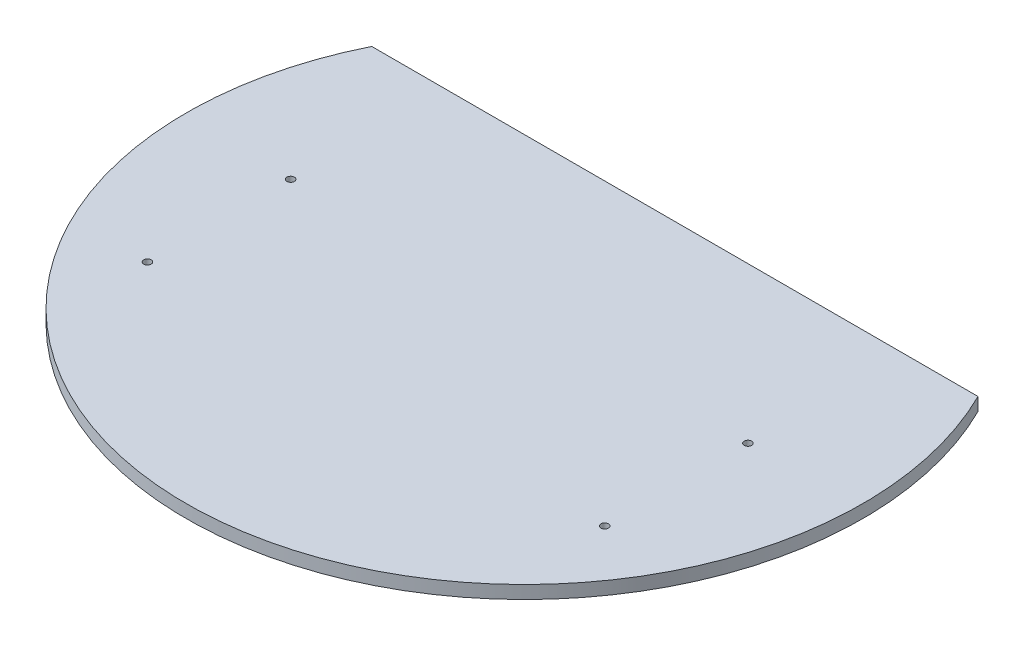
ISO-10303-21;
HEADER;
FILE_DESCRIPTION(('STEP AP214'),'2;1');
FILE_NAME('part.step','',(''),(''),'','','');
FILE_SCHEMA(('AUTOMOTIVE_DESIGN { 1 0 10303 214 1 1 1 1 }'));
ENDSEC;
DATA;
#1=APPLICATION_CONTEXT('core data for automotive mechanical design processes');
#2=APPLICATION_PROTOCOL_DEFINITION('international standard','automotive_design',2000,#1);
#3=PRODUCT_CONTEXT('',#1,'mechanical');
#4=PRODUCT('Part','Part','',(#3));
#5=PRODUCT_RELATED_PRODUCT_CATEGORY('part','',(#4));
#6=PRODUCT_DEFINITION_FORMATION('','',#4);
#7=PRODUCT_DEFINITION_CONTEXT('part definition',#1,'design');
#8=PRODUCT_DEFINITION('design','',#6,#7);
#9=PRODUCT_DEFINITION_SHAPE('','',#8);
#10=(LENGTH_UNIT() NAMED_UNIT(*) SI_UNIT(.MILLI.,.METRE.));
#11=(NAMED_UNIT(*) PLANE_ANGLE_UNIT() SI_UNIT($,.RADIAN.));
#12=(NAMED_UNIT(*) SI_UNIT($,.STERADIAN.) SOLID_ANGLE_UNIT());
#13=UNCERTAINTY_MEASURE_WITH_UNIT(LENGTH_MEASURE(1.E-05),#10,'distance_accuracy_value','');
#14=(GEOMETRIC_REPRESENTATION_CONTEXT(3) GLOBAL_UNCERTAINTY_ASSIGNED_CONTEXT((#13)) GLOBAL_UNIT_ASSIGNED_CONTEXT((#10,
#11,#12)) REPRESENTATION_CONTEXT('',''));
#15=CARTESIAN_POINT('',(0.,0.,0.));
#16=DIRECTION('',(0.,0.,1.));
#17=DIRECTION('',(1.,0.,0.));
#18=AXIS2_PLACEMENT_3D('',#15,#16,#17);
#19=CARTESIAN_POINT('',(0.,6.35,0.));
#20=DIRECTION('',(0.,-1.,0.));
#21=DIRECTION('',(0.,0.,-1.));
#22=AXIS2_PLACEMENT_3D('',#19,#20,#21);
#23=CYLINDRICAL_SURFACE('',#22,164.975);
#24=CARTESIAN_POINT('',(0.,6.35,0.));
#25=DIRECTION('',(0.,1.,0.));
#26=DIRECTION('',(0.,0.,1.));
#27=AXIS2_PLACEMENT_3D('',#24,#25,#26);
#28=CIRCLE('',#27,164.975);
#29=CARTESIAN_POINT('',(-147.793016902468,6.35,-73.30739921636));
#30=VERTEX_POINT('',#29);
#31=CARTESIAN_POINT('',(147.793016902468,6.35,-73.30739921636));
#32=VERTEX_POINT('',#31);
#33=EDGE_CURVE('E11',#30,#32,#28,.T.);
#34=ORIENTED_EDGE('',*,*,#33,.F.);
#35=DIRECTION('',(0.,1.,0.));
#36=VECTOR('',#35,1.);
#37=CARTESIAN_POINT('',(-147.793016902468,0.,-73.30739921636));
#38=LINE('',#37,#36);
#39=CARTESIAN_POINT('',(-147.793016902468,0.,-73.30739921636));
#40=VERTEX_POINT('',#39);
#41=EDGE_CURVE('E56',#40,#30,#38,.T.);
#42=ORIENTED_EDGE('',*,*,#41,.F.);
#43=CARTESIAN_POINT('',(0.,0.,0.));
#44=DIRECTION('',(0.,1.,0.));
#45=DIRECTION('',(0.,0.,1.));
#46=AXIS2_PLACEMENT_3D('',#43,#44,#45);
#47=CIRCLE('',#46,164.975);
#48=CARTESIAN_POINT('',(147.793016902468,0.,-73.30739921636));
#49=VERTEX_POINT('',#48);
#50=EDGE_CURVE('E36',#40,#49,#47,.T.);
#51=ORIENTED_EDGE('',*,*,#50,.T.);
#52=DIRECTION('',(0.,1.,0.));
#53=VECTOR('',#52,1.);
#54=CARTESIAN_POINT('',(147.793016902468,0.,-73.30739921636));
#55=LINE('',#54,#53);
#56=EDGE_CURVE('E47',#49,#32,#55,.T.);
#57=ORIENTED_EDGE('',*,*,#56,.T.);
#58=EDGE_LOOP('',(#34,#42,#51,#57));
#59=FACE_BOUND('',#58,.T.);
#60=ADVANCED_FACE('F33',(#59),#23,.T.);
#61=CARTESIAN_POINT('',(0.,6.35,0.));
#62=DIRECTION('',(0.,1.,0.));
#63=DIRECTION('',(0.,0.,1.));
#64=AXIS2_PLACEMENT_3D('',#61,#62,#63);
#65=PLANE('',#64);
#66=DIRECTION('',(1.,0.,0.));
#67=VECTOR('',#66,1.);
#68=CARTESIAN_POINT('',(-147.793016902468,6.35,-73.30739921636));
#69=LINE('',#68,#67);
#70=EDGE_CURVE('E59',#30,#32,#69,.T.);
#71=ORIENTED_EDGE('',*,*,#70,.F.);
#72=ORIENTED_EDGE('',*,*,#33,.T.);
#73=EDGE_LOOP('',(#71,#72));
#74=FACE_BOUND('',#73,.T.);
#75=CARTESIAN_POINT('',(111.465,6.35,72.39));
#76=DIRECTION('',(0.,-1.,0.));
#77=DIRECTION('',(0.,0.,-1.));
#78=AXIS2_PLACEMENT_3D('',#75,#76,#77);
#79=CIRCLE('',#78,1.82879999999999);
#80=CARTESIAN_POINT('',(111.465,6.35,70.5612));
#81=VERTEX_POINT('',#80);
#82=EDGE_CURVE('E72',#81,#81,#79,.T.);
#83=ORIENTED_EDGE('',*,*,#82,.T.);
#84=EDGE_LOOP('',(#83));
#85=FACE_BOUND('',#84,.T.);
#86=CARTESIAN_POINT('',(111.465,6.35,2.54));
#87=DIRECTION('',(0.,-1.,0.));
#88=DIRECTION('',(0.,0.,-1.));
#89=AXIS2_PLACEMENT_3D('',#86,#87,#88);
#90=CIRCLE('',#89,1.82879999999999);
#91=CARTESIAN_POINT('',(111.465,6.35,0.711200000000009));
#92=VERTEX_POINT('',#91);
#93=EDGE_CURVE('E81',#92,#92,#90,.T.);
#94=ORIENTED_EDGE('',*,*,#93,.T.);
#95=EDGE_LOOP('',(#94));
#96=FACE_BOUND('',#95,.T.);
#97=CARTESIAN_POINT('',(-111.465,6.35,72.39));
#98=DIRECTION('',(0.,-1.,0.));
#99=DIRECTION('',(0.,0.,-1.));
#100=AXIS2_PLACEMENT_3D('',#97,#98,#99);
#101=CIRCLE('',#100,1.82879999999999);
#102=CARTESIAN_POINT('',(-111.465,6.35,70.5612));
#103=VERTEX_POINT('',#102);
#104=EDGE_CURVE('E87',#103,#103,#101,.T.);
#105=ORIENTED_EDGE('',*,*,#104,.T.);
#106=EDGE_LOOP('',(#105));
#107=FACE_BOUND('',#106,.T.);
#108=CARTESIAN_POINT('',(-111.465,6.35,2.54));
#109=DIRECTION('',(0.,-1.,0.));
#110=DIRECTION('',(0.,0.,-1.));
#111=AXIS2_PLACEMENT_3D('',#108,#109,#110);
#112=CIRCLE('',#111,1.82879999999999);
#113=CARTESIAN_POINT('',(-111.465,6.35,0.711200000000009));
#114=VERTEX_POINT('',#113);
#115=EDGE_CURVE('E93',#114,#114,#112,.T.);
#116=ORIENTED_EDGE('',*,*,#115,.T.);
#117=EDGE_LOOP('',(#116));
#118=FACE_BOUND('',#117,.T.);
#119=ADVANCED_FACE('F66',(#74,#85,#96,#107,#118),#65,.T.);
#120=CARTESIAN_POINT('',(0.,0.,0.));
#121=DIRECTION('',(0.,1.,0.));
#122=DIRECTION('',(0.,0.,1.));
#123=AXIS2_PLACEMENT_3D('',#120,#121,#122);
#124=PLANE('',#123);
#125=CARTESIAN_POINT('',(111.465,0.,72.39));
#126=DIRECTION('',(0.,-1.,0.));
#127=DIRECTION('',(0.,0.,-1.));
#128=AXIS2_PLACEMENT_3D('',#125,#126,#127);
#129=CIRCLE('',#128,1.82879999999999);
#130=CARTESIAN_POINT('',(111.465,0.,70.5612));
#131=VERTEX_POINT('',#130);
#132=EDGE_CURVE('E69',#131,#131,#129,.T.);
#133=ORIENTED_EDGE('',*,*,#132,.F.);
#134=EDGE_LOOP('',(#133));
#135=FACE_BOUND('',#134,.T.);
#136=CARTESIAN_POINT('',(111.465,0.,2.54));
#137=DIRECTION('',(0.,-1.,0.));
#138=DIRECTION('',(0.,0.,-1.));
#139=AXIS2_PLACEMENT_3D('',#136,#137,#138);
#140=CIRCLE('',#139,1.82879999999999);
#141=CARTESIAN_POINT('',(111.465,0.,0.711200000000009));
#142=VERTEX_POINT('',#141);
#143=EDGE_CURVE('E78',#142,#142,#140,.T.);
#144=ORIENTED_EDGE('',*,*,#143,.F.);
#145=EDGE_LOOP('',(#144));
#146=FACE_BOUND('',#145,.T.);
#147=CARTESIAN_POINT('',(-111.465,0.,72.39));
#148=DIRECTION('',(0.,-1.,0.));
#149=DIRECTION('',(0.,0.,-1.));
#150=AXIS2_PLACEMENT_3D('',#147,#148,#149);
#151=CIRCLE('',#150,1.82879999999999);
#152=CARTESIAN_POINT('',(-111.465,0.,70.5612));
#153=VERTEX_POINT('',#152);
#154=EDGE_CURVE('E84',#153,#153,#151,.T.);
#155=ORIENTED_EDGE('',*,*,#154,.F.);
#156=EDGE_LOOP('',(#155));
#157=FACE_BOUND('',#156,.T.);
#158=CARTESIAN_POINT('',(-111.465,0.,2.54));
#159=DIRECTION('',(0.,-1.,0.));
#160=DIRECTION('',(0.,0.,-1.));
#161=AXIS2_PLACEMENT_3D('',#158,#159,#160);
#162=CIRCLE('',#161,1.82879999999999);
#163=CARTESIAN_POINT('',(-111.465,0.,0.711200000000009));
#164=VERTEX_POINT('',#163);
#165=EDGE_CURVE('E90',#164,#164,#162,.T.);
#166=ORIENTED_EDGE('',*,*,#165,.F.);
#167=EDGE_LOOP('',(#166));
#168=FACE_BOUND('',#167,.T.);
#169=ORIENTED_EDGE('',*,*,#50,.F.);
#170=DIRECTION('',(1.,0.,0.));
#171=VECTOR('',#170,1.);
#172=CARTESIAN_POINT('',(-147.793016902468,0.,-73.30739921636));
#173=LINE('',#172,#171);
#174=EDGE_CURVE('E52',#40,#49,#173,.T.);
#175=ORIENTED_EDGE('',*,*,#174,.T.);
#176=EDGE_LOOP('',(#169,#175));
#177=FACE_BOUND('',#176,.T.);
#178=ADVANCED_FACE('F102',(#135,#146,#157,#168,#177),#124,.F.);
#179=CARTESIAN_POINT('',(-111.465,0.,2.54));
#180=DIRECTION('',(0.,-1.,0.));
#181=DIRECTION('',(0.,0.,-1.));
#182=AXIS2_PLACEMENT_3D('',#179,#180,#181);
#183=CYLINDRICAL_SURFACE('',#182,1.82879999999999);
#184=ORIENTED_EDGE('',*,*,#115,.F.);
#185=EDGE_LOOP('',(#184));
#186=FACE_BOUND('',#185,.T.);
#187=ORIENTED_EDGE('',*,*,#165,.T.);
#188=EDGE_LOOP('',(#187));
#189=FACE_BOUND('',#188,.T.);
#190=ADVANCED_FACE('F98',(#186,#189),#183,.F.);
#191=CARTESIAN_POINT('',(-111.465,0.,72.39));
#192=DIRECTION('',(0.,-1.,0.));
#193=DIRECTION('',(0.,0.,-1.));
#194=AXIS2_PLACEMENT_3D('',#191,#192,#193);
#195=CYLINDRICAL_SURFACE('',#194,1.82879999999999);
#196=ORIENTED_EDGE('',*,*,#104,.F.);
#197=EDGE_LOOP('',(#196));
#198=FACE_BOUND('',#197,.T.);
#199=ORIENTED_EDGE('',*,*,#154,.T.);
#200=EDGE_LOOP('',(#199));
#201=FACE_BOUND('',#200,.T.);
#202=ADVANCED_FACE('F101',(#198,#201),#195,.F.);
#203=CARTESIAN_POINT('',(111.465,0.,2.54));
#204=DIRECTION('',(0.,-1.,0.));
#205=DIRECTION('',(0.,0.,-1.));
#206=AXIS2_PLACEMENT_3D('',#203,#204,#205);
#207=CYLINDRICAL_SURFACE('',#206,1.82879999999999);
#208=ORIENTED_EDGE('',*,*,#93,.F.);
#209=EDGE_LOOP('',(#208));
#210=FACE_BOUND('',#209,.T.);
#211=ORIENTED_EDGE('',*,*,#143,.T.);
#212=EDGE_LOOP('',(#211));
#213=FACE_BOUND('',#212,.T.);
#214=ADVANCED_FACE('F145',(#210,#213),#207,.F.);
#215=CARTESIAN_POINT('',(111.465,0.,72.39));
#216=DIRECTION('',(0.,-1.,0.));
#217=DIRECTION('',(0.,0.,-1.));
#218=AXIS2_PLACEMENT_3D('',#215,#216,#217);
#219=CYLINDRICAL_SURFACE('',#218,1.82879999999999);
#220=ORIENTED_EDGE('',*,*,#82,.F.);
#221=EDGE_LOOP('',(#220));
#222=FACE_BOUND('',#221,.T.);
#223=ORIENTED_EDGE('',*,*,#132,.T.);
#224=EDGE_LOOP('',(#223));
#225=FACE_BOUND('',#224,.T.);
#226=ADVANCED_FACE('F136',(#222,#225),#219,.F.);
#227=CARTESIAN_POINT('',(-147.793016902468,0.,-73.30739921636));
#228=DIRECTION('',(0.,0.,1.));
#229=DIRECTION('',(1.,0.,0.));
#230=AXIS2_PLACEMENT_3D('',#227,#228,#229);
#231=PLANE('',#230);
#232=ORIENTED_EDGE('',*,*,#70,.T.);
#233=ORIENTED_EDGE('',*,*,#56,.F.);
#234=ORIENTED_EDGE('',*,*,#174,.F.);
#235=ORIENTED_EDGE('',*,*,#41,.T.);
#236=EDGE_LOOP('',(#232,#233,#234,#235));
#237=FACE_BOUND('',#236,.T.);
#238=ADVANCED_FACE('F58',(#237),#231,.F.);
#239=CLOSED_SHELL('',(#60,#119,#178,#190,#202,#214,#226,#238));
#240=MANIFOLD_SOLID_BREP('B2',#239);
#241=ADVANCED_BREP_SHAPE_REPRESENTATION('',(#18,#240),#14);
#242=SHAPE_DEFINITION_REPRESENTATION(#9,#241);
ENDSEC;
END-ISO-10303-21;
